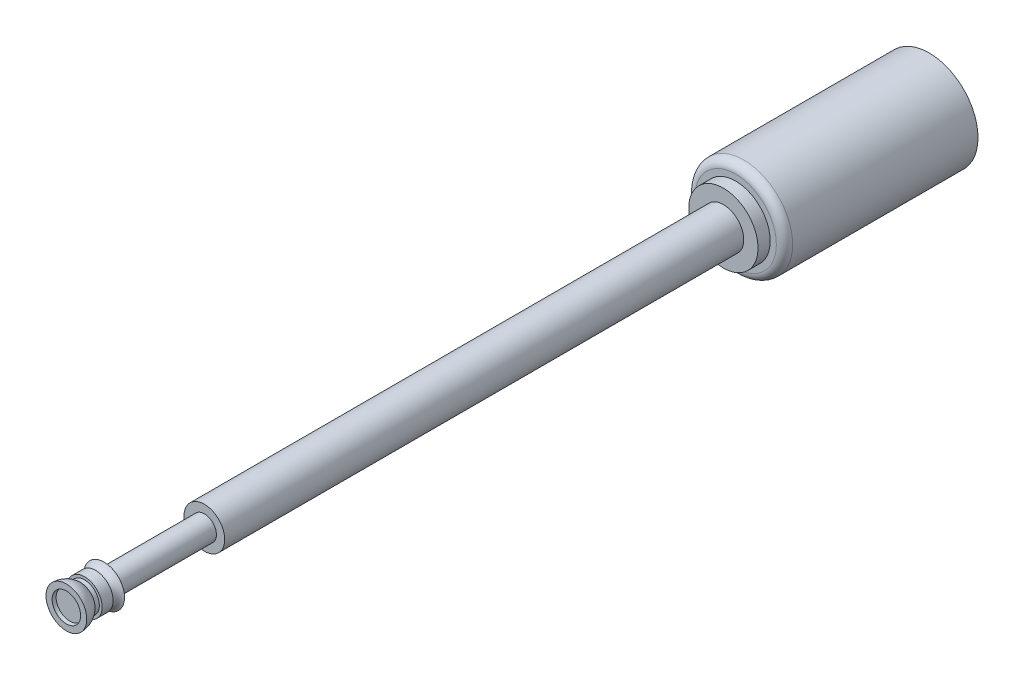
ISO-10303-21;
HEADER;
FILE_DESCRIPTION(('STEP AP214'),'2;1');
FILE_NAME('part.step','',(''),(''),'','','');
FILE_SCHEMA(('AUTOMOTIVE_DESIGN { 1 0 10303 214 1 1 1 1 }'));
ENDSEC;
DATA;
#1=APPLICATION_CONTEXT('core data for automotive mechanical design processes');
#2=APPLICATION_PROTOCOL_DEFINITION('international standard','automotive_design',2000,#1);
#3=PRODUCT_CONTEXT('',#1,'mechanical');
#4=PRODUCT('Part','Part','',(#3));
#5=PRODUCT_RELATED_PRODUCT_CATEGORY('part','',(#4));
#6=PRODUCT_DEFINITION_FORMATION('','',#4);
#7=PRODUCT_DEFINITION_CONTEXT('part definition',#1,'design');
#8=PRODUCT_DEFINITION('design','',#6,#7);
#9=PRODUCT_DEFINITION_SHAPE('','',#8);
#10=(LENGTH_UNIT() NAMED_UNIT(*) SI_UNIT(.MILLI.,.METRE.));
#11=(NAMED_UNIT(*) PLANE_ANGLE_UNIT() SI_UNIT($,.RADIAN.));
#12=(NAMED_UNIT(*) SI_UNIT($,.STERADIAN.) SOLID_ANGLE_UNIT());
#13=UNCERTAINTY_MEASURE_WITH_UNIT(LENGTH_MEASURE(1.E-05),#10,'distance_accuracy_value','');
#14=(GEOMETRIC_REPRESENTATION_CONTEXT(3) GLOBAL_UNCERTAINTY_ASSIGNED_CONTEXT((#13)) GLOBAL_UNIT_ASSIGNED_CONTEXT((#10,
#11,#12)) REPRESENTATION_CONTEXT('',''));
#15=CARTESIAN_POINT('',(0.,0.,0.));
#16=DIRECTION('',(0.,0.,1.));
#17=DIRECTION('',(1.,0.,0.));
#18=AXIS2_PLACEMENT_3D('',#15,#16,#17);
#19=CARTESIAN_POINT('',(0.,0.,393.7));
#20=DIRECTION('',(0.,0.,-1.));
#21=DIRECTION('',(-1.,0.,0.));
#22=AXIS2_PLACEMENT_3D('',#19,#20,#21);
#23=CYLINDRICAL_SURFACE('',#22,12.7);
#24=CARTESIAN_POINT('',(0.,0.,7.62000000000002));
#25=DIRECTION('',(0.,0.,1.));
#26=DIRECTION('',(1.,0.,0.));
#27=AXIS2_PLACEMENT_3D('',#24,#25,#26);
#28=CIRCLE('',#27,12.7);
#29=CARTESIAN_POINT('',(12.7,0.,7.62000000000002));
#30=VERTEX_POINT('',#29);
#31=EDGE_CURVE('E54',#30,#30,#28,.T.);
#32=ORIENTED_EDGE('',*,*,#31,.T.);
#33=EDGE_LOOP('',(#32));
#34=FACE_BOUND('',#33,.T.);
#35=CARTESIAN_POINT('',(0.,0.,331.216));
#36=DIRECTION('',(0.,0.,1.));
#37=DIRECTION('',(1.,0.,0.));
#38=AXIS2_PLACEMENT_3D('',#35,#36,#37);
#39=CIRCLE('',#38,12.7);
#40=CARTESIAN_POINT('',(12.7,0.,331.216));
#41=VERTEX_POINT('',#40);
#42=EDGE_CURVE('E40',#41,#41,#39,.T.);
#43=ORIENTED_EDGE('',*,*,#42,.F.);
#44=EDGE_LOOP('',(#43));
#45=FACE_BOUND('',#44,.T.);
#46=ADVANCED_FACE('F37',(#34,#45),#23,.T.);
#47=CARTESIAN_POINT('',(0.,0.,7.62));
#48=DIRECTION('',(0.,0.,-1.));
#49=DIRECTION('',(-1.,0.,0.));
#50=AXIS2_PLACEMENT_3D('',#47,#48,#49);
#51=CYLINDRICAL_SURFACE('',#50,21.59);
#52=CARTESIAN_POINT('',(0.,0.,7.62));
#53=DIRECTION('',(0.,0.,1.));
#54=DIRECTION('',(1.,0.,0.));
#55=AXIS2_PLACEMENT_3D('',#52,#53,#54);
#56=CIRCLE('',#55,21.59);
#57=CARTESIAN_POINT('',(-21.59,0.,7.62));
#58=VERTEX_POINT('',#57);
#59=EDGE_CURVE('E57',#58,#58,#56,.T.);
#60=CARTESIAN_POINT('',(0.,0.,0.));
#61=DIRECTION('',(0.,0.,1.));
#62=DIRECTION('',(1.,0.,0.));
#63=AXIS2_PLACEMENT_3D('',#60,#61,#62);
#64=CIRCLE('',#63,21.59);
#65=CARTESIAN_POINT('',(-21.59,0.,0.));
#66=VERTEX_POINT('',#65);
#67=EDGE_CURVE('E60',#66,#66,#64,.T.);
#68=CARTESIAN_POINT('',(-21.59,0.,7.62));
#69=CARTESIAN_POINT('',(-21.59,0.,7.540625));
#70=CARTESIAN_POINT('',(-21.59,0.,7.46125));
#71=CARTESIAN_POINT('',(-21.59,0.,7.3025));
#72=CARTESIAN_POINT('',(-21.59,0.,7.223125));
#73=CARTESIAN_POINT('',(-21.59,0.,7.064375));
#74=CARTESIAN_POINT('',(-21.59,0.,6.985));
#75=CARTESIAN_POINT('',(-21.59,0.,6.82625));
#76=CARTESIAN_POINT('',(-21.59,0.,6.746875));
#77=CARTESIAN_POINT('',(-21.59,0.,6.588125));
#78=CARTESIAN_POINT('',(-21.59,0.,6.50875));
#79=CARTESIAN_POINT('',(-21.59,0.,6.35));
#80=CARTESIAN_POINT('',(-21.59,0.,6.270625));
#81=CARTESIAN_POINT('',(-21.59,0.,6.111875));
#82=CARTESIAN_POINT('',(-21.59,0.,6.0325));
#83=CARTESIAN_POINT('',(-21.59,0.,5.87375));
#84=CARTESIAN_POINT('',(-21.59,0.,5.794375));
#85=CARTESIAN_POINT('',(-21.59,0.,5.635625));
#86=CARTESIAN_POINT('',(-21.59,0.,5.55625));
#87=CARTESIAN_POINT('',(-21.59,0.,5.3975));
#88=CARTESIAN_POINT('',(-21.59,0.,5.318125));
#89=CARTESIAN_POINT('',(-21.59,0.,5.159375));
#90=CARTESIAN_POINT('',(-21.59,0.,5.08));
#91=CARTESIAN_POINT('',(-21.59,0.,4.92125));
#92=CARTESIAN_POINT('',(-21.59,0.,4.841875));
#93=CARTESIAN_POINT('',(-21.59,0.,4.683125));
#94=CARTESIAN_POINT('',(-21.59,0.,4.60375));
#95=CARTESIAN_POINT('',(-21.59,0.,4.445));
#96=CARTESIAN_POINT('',(-21.59,0.,4.365625));
#97=CARTESIAN_POINT('',(-21.59,0.,4.206875));
#98=CARTESIAN_POINT('',(-21.59,0.,4.1275));
#99=CARTESIAN_POINT('',(-21.59,0.,3.96875));
#100=CARTESIAN_POINT('',(-21.59,0.,3.889375));
#101=CARTESIAN_POINT('',(-21.59,0.,3.730625));
#102=CARTESIAN_POINT('',(-21.59,0.,3.65125));
#103=CARTESIAN_POINT('',(-21.59,0.,3.4925));
#104=CARTESIAN_POINT('',(-21.59,0.,3.413125));
#105=CARTESIAN_POINT('',(-21.59,0.,3.254375));
#106=CARTESIAN_POINT('',(-21.59,0.,3.175));
#107=CARTESIAN_POINT('',(-21.59,0.,3.01625));
#108=CARTESIAN_POINT('',(-21.59,0.,2.936875));
#109=CARTESIAN_POINT('',(-21.59,0.,2.778125));
#110=CARTESIAN_POINT('',(-21.59,0.,2.69875));
#111=CARTESIAN_POINT('',(-21.59,0.,2.54));
#112=CARTESIAN_POINT('',(-21.59,0.,2.460625));
#113=CARTESIAN_POINT('',(-21.59,0.,2.301875));
#114=CARTESIAN_POINT('',(-21.59,0.,2.2225));
#115=CARTESIAN_POINT('',(-21.59,0.,2.06375));
#116=CARTESIAN_POINT('',(-21.59,0.,1.984375));
#117=CARTESIAN_POINT('',(-21.59,0.,1.825625));
#118=CARTESIAN_POINT('',(-21.59,0.,1.74625));
#119=CARTESIAN_POINT('',(-21.59,0.,1.5875));
#120=CARTESIAN_POINT('',(-21.59,0.,1.508125));
#121=CARTESIAN_POINT('',(-21.59,0.,1.349375));
#122=CARTESIAN_POINT('',(-21.59,0.,1.27));
#123=CARTESIAN_POINT('',(-21.59,0.,1.11125));
#124=CARTESIAN_POINT('',(-21.59,0.,1.031875));
#125=CARTESIAN_POINT('',(-21.59,0.,0.873125));
#126=CARTESIAN_POINT('',(-21.59,0.,0.79375));
#127=CARTESIAN_POINT('',(-21.59,0.,0.635));
#128=CARTESIAN_POINT('',(-21.59,0.,0.555625));
#129=CARTESIAN_POINT('',(-21.59,0.,0.396875));
#130=CARTESIAN_POINT('',(-21.59,0.,0.3175));
#131=CARTESIAN_POINT('',(-21.59,0.,0.15875));
#132=CARTESIAN_POINT('',(-21.59,0.,0.0793749999999999));
#133=CARTESIAN_POINT('',(-21.59,0.,0.));
#134=B_SPLINE_CURVE_WITH_KNOTS('',3,(#68,#69,#70,#71,#72,#73,#74,#75,#76,#77,#78,#79,#80,#81,
#82,#83,#84,#85,#86,#87,#88,#89,#90,#91,#92,#93,#94,#95,#96,#97,#98,#99,#100,#101,#102,#103,
#104,#105,#106,#107,#108,#109,#110,#111,#112,#113,#114,#115,#116,#117,#118,#119,#120,#121,#122,
#123,#124,#125,#126,#127,#128,#129,#130,#131,#132,#133),.UNSPECIFIED.,.F.,.F.,(4,2,2,2,2,2,2,2,
2,2,2,2,2,2,2,2,2,2,2,2,2,2,2,2,2,2,2,2,2,2,2,2,4),(0.,0.238125,0.476249999999999,0.714375,
0.952499999999999,1.190625,1.42875,1.666875,1.905,2.143125,2.38125,2.619375,2.8575,3.095625,
3.33375,3.571875,3.81,4.048125,4.28625,4.524375,4.7625,5.000625,5.23875,5.476875,5.715,5.953125,
6.19125,6.429375,6.6675,6.905625,7.14375,7.381875,7.62),.UNSPECIFIED.);
#135=EDGE_CURVE('BSEAM125',#58,#66,#134,.T.);
#136=ORIENTED_EDGE('',*,*,#59,.F.);
#137=ORIENTED_EDGE('',*,*,#67,.T.);
#138=ORIENTED_EDGE('',*,*,#135,.T.);
#139=ORIENTED_EDGE('',*,*,#135,.F.);
#140=EDGE_LOOP('',(#136,#138,#137,#139));
#141=FACE_BOUND('',#140,.T.);
#142=ADVANCED_FACE('F125',(#141),#51,.T.);
#143=CARTESIAN_POINT('',(0.,0.,7.62));
#144=DIRECTION('',(0.,0.,1.));
#145=DIRECTION('',(1.,0.,0.));
#146=AXIS2_PLACEMENT_3D('',#143,#144,#145);
#147=PLANE('',#146);
#148=ORIENTED_EDGE('',*,*,#31,.F.);
#149=EDGE_LOOP('',(#148));
#150=FACE_BOUND('',#149,.T.);
#151=ORIENTED_EDGE('',*,*,#59,.T.);
#152=EDGE_LOOP('',(#151));
#153=FACE_BOUND('',#152,.T.);
#154=ADVANCED_FACE('F130',(#150,#153),#147,.T.);
#155=CARTESIAN_POINT('',(0.,0.,-120.65));
#156=DIRECTION('',(0.,0.,1.));
#157=DIRECTION('',(1.,0.,0.));
#158=AXIS2_PLACEMENT_3D('',#155,#156,#157);
#159=CYLINDRICAL_SURFACE('',#158,12.7);
#160=CARTESIAN_POINT('',(0.,0.,-120.65));
#161=DIRECTION('',(0.,0.,1.));
#162=DIRECTION('',(1.,0.,0.));
#163=AXIS2_PLACEMENT_3D('',#160,#161,#162);
#164=CIRCLE('',#163,12.7);
#165=CARTESIAN_POINT('',(12.7,0.,-120.65));
#166=VERTEX_POINT('',#165);
#167=EDGE_CURVE('E72',#166,#166,#164,.T.);
#168=CARTESIAN_POINT('',(0.,0.,0.));
#169=DIRECTION('',(0.,0.,1.));
#170=DIRECTION('',(1.,0.,0.));
#171=AXIS2_PLACEMENT_3D('',#168,#169,#170);
#172=CIRCLE('',#171,12.7);
#173=CARTESIAN_POINT('',(12.7,0.,0.));
#174=VERTEX_POINT('',#173);
#175=EDGE_CURVE('E49',#174,#174,#172,.T.);
#176=CARTESIAN_POINT('',(12.7,0.,-120.65));
#177=CARTESIAN_POINT('',(12.7,0.,-119.393229166667));
#178=CARTESIAN_POINT('',(12.7,0.,-118.136458333333));
#179=CARTESIAN_POINT('',(12.7,0.,-115.622916666667));
#180=CARTESIAN_POINT('',(12.7,0.,-114.366145833333));
#181=CARTESIAN_POINT('',(12.7,0.,-111.852604166667));
#182=CARTESIAN_POINT('',(12.7,0.,-110.595833333333));
#183=CARTESIAN_POINT('',(12.7,0.,-108.082291666667));
#184=CARTESIAN_POINT('',(12.7,0.,-106.825520833333));
#185=CARTESIAN_POINT('',(12.7,0.,-104.311979166667));
#186=CARTESIAN_POINT('',(12.7,0.,-103.055208333333));
#187=CARTESIAN_POINT('',(12.7,0.,-100.541666666667));
#188=CARTESIAN_POINT('',(12.7,0.,-99.2848958333334));
#189=CARTESIAN_POINT('',(12.7,0.,-96.7713541666667));
#190=CARTESIAN_POINT('',(12.7,0.,-95.5145833333333));
#191=CARTESIAN_POINT('',(12.7,0.,-93.0010416666667));
#192=CARTESIAN_POINT('',(12.7,0.,-91.7442708333333));
#193=CARTESIAN_POINT('',(12.7,0.,-89.2307291666667));
#194=CARTESIAN_POINT('',(12.7,0.,-87.9739583333333));
#195=CARTESIAN_POINT('',(12.7,0.,-85.4604166666667));
#196=CARTESIAN_POINT('',(12.7,0.,-84.2036458333333));
#197=CARTESIAN_POINT('',(12.7,0.,-81.6901041666667));
#198=CARTESIAN_POINT('',(12.7,0.,-80.4333333333333));
#199=CARTESIAN_POINT('',(12.7,0.,-77.9197916666667));
#200=CARTESIAN_POINT('',(12.7,0.,-76.6630208333333));
#201=CARTESIAN_POINT('',(12.7,0.,-74.1494791666667));
#202=CARTESIAN_POINT('',(12.7,0.,-72.8927083333333));
#203=CARTESIAN_POINT('',(12.7,0.,-70.3791666666667));
#204=CARTESIAN_POINT('',(12.7,0.,-69.1223958333333));
#205=CARTESIAN_POINT('',(12.7,0.,-66.6088541666667));
#206=CARTESIAN_POINT('',(12.7,0.,-65.3520833333333));
#207=CARTESIAN_POINT('',(12.7,0.,-62.8385416666667));
#208=CARTESIAN_POINT('',(12.7,0.,-61.5817708333333));
#209=CARTESIAN_POINT('',(12.7,0.,-59.0682291666667));
#210=CARTESIAN_POINT('',(12.7,0.,-57.8114583333333));
#211=CARTESIAN_POINT('',(12.7,0.,-55.2979166666667));
#212=CARTESIAN_POINT('',(12.7,0.,-54.0411458333333));
#213=CARTESIAN_POINT('',(12.7,0.,-51.5276041666667));
#214=CARTESIAN_POINT('',(12.7,0.,-50.2708333333333));
#215=CARTESIAN_POINT('',(12.7,0.,-47.7572916666667));
#216=CARTESIAN_POINT('',(12.7,0.,-46.5005208333333));
#217=CARTESIAN_POINT('',(12.7,0.,-43.9869791666667));
#218=CARTESIAN_POINT('',(12.7,0.,-42.7302083333333));
#219=CARTESIAN_POINT('',(12.7,0.,-40.2166666666667));
#220=CARTESIAN_POINT('',(12.7,0.,-38.9598958333333));
#221=CARTESIAN_POINT('',(12.7,0.,-36.4463541666667));
#222=CARTESIAN_POINT('',(12.7,0.,-35.1895833333333));
#223=CARTESIAN_POINT('',(12.7,0.,-32.6760416666667));
#224=CARTESIAN_POINT('',(12.7,0.,-31.4192708333333));
#225=CARTESIAN_POINT('',(12.7,0.,-28.9057291666667));
#226=CARTESIAN_POINT('',(12.7,0.,-27.6489583333333));
#227=CARTESIAN_POINT('',(12.7,0.,-25.1354166666667));
#228=CARTESIAN_POINT('',(12.7,0.,-23.8786458333333));
#229=CARTESIAN_POINT('',(12.7,0.,-21.3651041666667));
#230=CARTESIAN_POINT('',(12.7,0.,-20.1083333333333));
#231=CARTESIAN_POINT('',(12.7,0.,-17.5947916666667));
#232=CARTESIAN_POINT('',(12.7,0.,-16.3380208333333));
#233=CARTESIAN_POINT('',(12.7,0.,-13.8244791666667));
#234=CARTESIAN_POINT('',(12.7,0.,-12.5677083333333));
#235=CARTESIAN_POINT('',(12.7,0.,-10.0541666666667));
#236=CARTESIAN_POINT('',(12.7,0.,-8.79739583333333));
#237=CARTESIAN_POINT('',(12.7,0.,-6.28385416666666));
#238=CARTESIAN_POINT('',(12.7,0.,-5.02708333333333));
#239=CARTESIAN_POINT('',(12.7,0.,-2.51354166666666));
#240=CARTESIAN_POINT('',(12.7,0.,-1.25677083333333));
#241=CARTESIAN_POINT('',(12.7,0.,0.));
#242=B_SPLINE_CURVE_WITH_KNOTS('',3,(#176,#177,#178,#179,#180,#181,#182,#183,#184,#185,#186,
#187,#188,#189,#190,#191,#192,#193,#194,#195,#196,#197,#198,#199,#200,#201,#202,#203,#204,#205,
#206,#207,#208,#209,#210,#211,#212,#213,#214,#215,#216,#217,#218,#219,#220,#221,#222,#223,#224,
#225,#226,#227,#228,#229,#230,#231,#232,#233,#234,#235,#236,#237,#238,#239,#240,#241),
.UNSPECIFIED.,.F.,.F.,(4,2,2,2,2,2,2,2,2,2,2,2,2,2,2,2,2,2,2,2,2,2,2,2,2,2,2,2,2,2,2,2,4),(0.,
3.7703125,7.540625,11.3109375,15.08125,18.8515625,22.621875,26.3921875,30.1625,33.9328125,
37.703125,41.4734375,45.24375,49.0140625,52.784375,56.5546875,60.325,64.0953125,67.865625,
71.6359375,75.40625,79.1765625,82.946875,86.7171875,90.4875,94.2578125,98.028125,101.7984375,
105.56875,109.3390625,113.109375,116.8796875,120.65),.UNSPECIFIED.);
#243=EDGE_CURVE('BSEAM156',#166,#174,#242,.T.);
#244=ORIENTED_EDGE('',*,*,#167,.F.);
#245=ORIENTED_EDGE('',*,*,#175,.T.);
#246=ORIENTED_EDGE('',*,*,#243,.T.);
#247=ORIENTED_EDGE('',*,*,#243,.F.);
#248=EDGE_LOOP('',(#244,#246,#245,#247));
#249=FACE_BOUND('',#248,.T.);
#250=ADVANCED_FACE('F156',(#249),#159,.F.);
#251=CARTESIAN_POINT('',(0.,0.,-120.65));
#252=DIRECTION('',(0.,0.,1.));
#253=DIRECTION('',(1.,0.,0.));
#254=AXIS2_PLACEMENT_3D('',#251,#252,#253);
#255=CYLINDRICAL_SURFACE('',#254,30.48);
#256=CARTESIAN_POINT('',(0.,0.,-5.08));
#257=DIRECTION('',(0.,0.,1.));
#258=DIRECTION('',(1.,0.,0.));
#259=AXIS2_PLACEMENT_3D('',#256,#257,#258);
#260=CIRCLE('',#259,30.48);
#261=CARTESIAN_POINT('',(30.48,0.,-5.08));
#262=VERTEX_POINT('',#261);
#263=EDGE_CURVE('E63',#262,#262,#260,.F.);
#264=CARTESIAN_POINT('',(0.,0.,-120.65));
#265=DIRECTION('',(0.,0.,1.));
#266=DIRECTION('',(1.,0.,0.));
#267=AXIS2_PLACEMENT_3D('',#264,#265,#266);
#268=CIRCLE('',#267,30.48);
#269=CARTESIAN_POINT('',(30.48,0.,-120.65));
#270=VERTEX_POINT('',#269);
#271=EDGE_CURVE('E69',#270,#270,#268,.T.);
#272=CARTESIAN_POINT('',(30.48,0.,-5.08));
#273=CARTESIAN_POINT('',(30.48,0.,-6.28385416666667));
#274=CARTESIAN_POINT('',(30.48,0.,-7.48770833333333));
#275=CARTESIAN_POINT('',(30.48,0.,-9.89541666666667));
#276=CARTESIAN_POINT('',(30.48,0.,-11.0992708333333));
#277=CARTESIAN_POINT('',(30.48,0.,-13.5069791666667));
#278=CARTESIAN_POINT('',(30.48,0.,-14.7108333333333));
#279=CARTESIAN_POINT('',(30.48,0.,-17.1185416666667));
#280=CARTESIAN_POINT('',(30.48,0.,-18.3223958333333));
#281=CARTESIAN_POINT('',(30.48,0.,-20.7301041666667));
#282=CARTESIAN_POINT('',(30.48,0.,-21.9339583333333));
#283=CARTESIAN_POINT('',(30.48,0.,-24.3416666666667));
#284=CARTESIAN_POINT('',(30.48,0.,-25.5455208333333));
#285=CARTESIAN_POINT('',(30.48,0.,-27.9532291666667));
#286=CARTESIAN_POINT('',(30.48,0.,-29.1570833333333));
#287=CARTESIAN_POINT('',(30.48,0.,-31.5647916666667));
#288=CARTESIAN_POINT('',(30.48,0.,-32.7686458333333));
#289=CARTESIAN_POINT('',(30.48,0.,-35.1763541666667));
#290=CARTESIAN_POINT('',(30.48,0.,-36.3802083333333));
#291=CARTESIAN_POINT('',(30.48,0.,-38.7879166666667));
#292=CARTESIAN_POINT('',(30.48,0.,-39.9917708333333));
#293=CARTESIAN_POINT('',(30.48,0.,-42.3994791666667));
#294=CARTESIAN_POINT('',(30.48,0.,-43.6033333333333));
#295=CARTESIAN_POINT('',(30.48,0.,-46.0110416666667));
#296=CARTESIAN_POINT('',(30.48,0.,-47.2148958333333));
#297=CARTESIAN_POINT('',(30.48,0.,-49.6226041666667));
#298=CARTESIAN_POINT('',(30.48,0.,-50.8264583333333));
#299=CARTESIAN_POINT('',(30.48,0.,-53.2341666666667));
#300=CARTESIAN_POINT('',(30.48,0.,-54.4380208333333));
#301=CARTESIAN_POINT('',(30.48,0.,-56.8457291666667));
#302=CARTESIAN_POINT('',(30.48,0.,-58.0495833333333));
#303=CARTESIAN_POINT('',(30.48,0.,-60.4572916666667));
#304=CARTESIAN_POINT('',(30.48,0.,-61.6611458333333));
#305=CARTESIAN_POINT('',(30.48,0.,-64.0688541666667));
#306=CARTESIAN_POINT('',(30.48,0.,-65.2727083333333));
#307=CARTESIAN_POINT('',(30.48,0.,-67.6804166666667));
#308=CARTESIAN_POINT('',(30.48,0.,-68.8842708333333));
#309=CARTESIAN_POINT('',(30.48,0.,-71.2919791666667));
#310=CARTESIAN_POINT('',(30.48,0.,-72.4958333333333));
#311=CARTESIAN_POINT('',(30.48,0.,-74.9035416666667));
#312=CARTESIAN_POINT('',(30.48,0.,-76.1073958333333));
#313=CARTESIAN_POINT('',(30.48,0.,-78.5151041666667));
#314=CARTESIAN_POINT('',(30.48,0.,-79.7189583333333));
#315=CARTESIAN_POINT('',(30.48,0.,-82.1266666666667));
#316=CARTESIAN_POINT('',(30.48,0.,-83.3305208333333));
#317=CARTESIAN_POINT('',(30.48,0.,-85.7382291666667));
#318=CARTESIAN_POINT('',(30.48,0.,-86.9420833333333));
#319=CARTESIAN_POINT('',(30.48,0.,-89.3497916666667));
#320=CARTESIAN_POINT('',(30.48,0.,-90.5536458333333));
#321=CARTESIAN_POINT('',(30.48,0.,-92.9613541666667));
#322=CARTESIAN_POINT('',(30.48,0.,-94.1652083333333));
#323=CARTESIAN_POINT('',(30.48,0.,-96.5729166666667));
#324=CARTESIAN_POINT('',(30.48,0.,-97.7767708333333));
#325=CARTESIAN_POINT('',(30.48,0.,-100.184479166667));
#326=CARTESIAN_POINT('',(30.48,0.,-101.388333333333));
#327=CARTESIAN_POINT('',(30.48,0.,-103.796041666667));
#328=CARTESIAN_POINT('',(30.48,0.,-104.999895833333));
#329=CARTESIAN_POINT('',(30.48,0.,-107.407604166667));
#330=CARTESIAN_POINT('',(30.48,0.,-108.611458333333));
#331=CARTESIAN_POINT('',(30.48,0.,-111.019166666667));
#332=CARTESIAN_POINT('',(30.48,0.,-112.223020833333));
#333=CARTESIAN_POINT('',(30.48,0.,-114.630729166667));
#334=CARTESIAN_POINT('',(30.48,0.,-115.834583333333));
#335=CARTESIAN_POINT('',(30.48,0.,-118.242291666667));
#336=CARTESIAN_POINT('',(30.48,0.,-119.446145833333));
#337=CARTESIAN_POINT('',(30.48,0.,-120.65));
#338=B_SPLINE_CURVE_WITH_KNOTS('',3,(#272,#273,#274,#275,#276,#277,#278,#279,#280,#281,#282,
#283,#284,#285,#286,#287,#288,#289,#290,#291,#292,#293,#294,#295,#296,#297,#298,#299,#300,#301,
#302,#303,#304,#305,#306,#307,#308,#309,#310,#311,#312,#313,#314,#315,#316,#317,#318,#319,#320,
#321,#322,#323,#324,#325,#326,#327,#328,#329,#330,#331,#332,#333,#334,#335,#336,#337),
.UNSPECIFIED.,.F.,.F.,(4,2,2,2,2,2,2,2,2,2,2,2,2,2,2,2,2,2,2,2,2,2,2,2,2,2,2,2,2,2,2,2,4),(0.,
3.6115625,7.223125,10.8346875,14.44625,18.0578125,21.669375,25.2809375,28.8925,32.5040625,
36.115625,39.7271875,43.33875,46.9503125,50.561875,54.1734375,57.785,61.3965625,65.008125,
68.6196875,72.23125,75.8428125,79.454375,83.0659375,86.6775,90.2890625,93.900625,97.5121875,
101.12375,104.7353125,108.346875,111.9584375,115.57),.UNSPECIFIED.);
#339=EDGE_CURVE('BSEAM161',#262,#270,#338,.T.);
#340=ORIENTED_EDGE('',*,*,#263,.T.);
#341=ORIENTED_EDGE('',*,*,#271,.T.);
#342=ORIENTED_EDGE('',*,*,#339,.T.);
#343=ORIENTED_EDGE('',*,*,#339,.F.);
#344=EDGE_LOOP('',(#340,#342,#341,#343));
#345=FACE_BOUND('',#344,.T.);
#346=ADVANCED_FACE('F161',(#345),#255,.T.);
#347=CARTESIAN_POINT('',(0.,0.,-120.65));
#348=DIRECTION('',(0.,0.,1.));
#349=DIRECTION('',(1.,0.,0.));
#350=AXIS2_PLACEMENT_3D('',#347,#348,#349);
#351=PLANE('',#350);
#352=ORIENTED_EDGE('',*,*,#167,.T.);
#353=EDGE_LOOP('',(#352));
#354=FACE_BOUND('',#353,.T.);
#355=ORIENTED_EDGE('',*,*,#271,.F.);
#356=EDGE_LOOP('',(#355));
#357=FACE_BOUND('',#356,.T.);
#358=ADVANCED_FACE('F165',(#354,#357),#351,.F.);
#359=CARTESIAN_POINT('',(0.,0.,0.));
#360=DIRECTION('',(0.,0.,1.));
#361=DIRECTION('',(1.,0.,0.));
#362=AXIS2_PLACEMENT_3D('',#359,#360,#361);
#363=PLANE('',#362);
#364=ORIENTED_EDGE('',*,*,#67,.F.);
#365=EDGE_LOOP('',(#364));
#366=FACE_BOUND('',#365,.T.);
#367=CARTESIAN_POINT('',(0.,0.,0.));
#368=DIRECTION('',(0.,0.,1.));
#369=DIRECTION('',(1.,0.,0.));
#370=AXIS2_PLACEMENT_3D('',#367,#368,#369);
#371=CIRCLE('',#370,25.4);
#372=CARTESIAN_POINT('',(25.4,0.,0.));
#373=VERTEX_POINT('',#372);
#374=EDGE_CURVE('E66',#373,#373,#371,.T.);
#375=ORIENTED_EDGE('',*,*,#374,.T.);
#376=EDGE_LOOP('',(#375));
#377=FACE_BOUND('',#376,.T.);
#378=ADVANCED_FACE('F150',(#366,#377),#363,.T.);
#379=CARTESIAN_POINT('',(0.,0.,-5.08));
#380=DIRECTION('',(0.,0.,1.));
#381=DIRECTION('',(1.,0.,0.));
#382=AXIS2_PLACEMENT_3D('',#379,#380,#381);
#383=TOROIDAL_SURFACE('',#382,25.4,5.08);
#384=ORIENTED_EDGE('',*,*,#263,.F.);
#385=EDGE_LOOP('',(#384));
#386=FACE_BOUND('',#385,.T.);
#387=ORIENTED_EDGE('',*,*,#374,.F.);
#388=EDGE_LOOP('',(#387));
#389=FACE_BOUND('',#388,.T.);
#390=ADVANCED_FACE('F144',(#386,#389),#383,.T.);
#391=CARTESIAN_POINT('',(0.,0.,0.));
#392=DIRECTION('',(0.,0.,1.));
#393=DIRECTION('',(1.,0.,0.));
#394=AXIS2_PLACEMENT_3D('',#391,#392,#393);
#395=PLANE('',#394);
#396=ORIENTED_EDGE('',*,*,#175,.F.);
#397=EDGE_LOOP('',(#396));
#398=FACE_BOUND('',#397,.T.);
#399=ADVANCED_FACE('F139',(#398),#395,.F.);
#400=CARTESIAN_POINT('',(-26.9315656539725,0.,331.216));
#401=DIRECTION('',(0.,0.,1.));
#402=DIRECTION('',(1.,0.,0.));
#403=AXIS2_PLACEMENT_3D('',#400,#401,#402);
#404=PLANE('',#403);
#405=CARTESIAN_POINT('',(0.,0.,331.216));
#406=DIRECTION('',(0.,0.,1.));
#407=DIRECTION('',(1.,0.,0.));
#408=AXIS2_PLACEMENT_3D('',#405,#406,#407);
#409=CIRCLE('',#408,7.52347999999999);
#410=CARTESIAN_POINT('',(7.52347999999998,0.,331.216));
#411=VERTEX_POINT('',#410);
#412=EDGE_CURVE('E99',#411,#411,#409,.T.);
#413=ORIENTED_EDGE('',*,*,#412,.F.);
#414=EDGE_LOOP('',(#413));
#415=FACE_BOUND('',#414,.T.);
#416=ORIENTED_EDGE('',*,*,#42,.T.);
#417=EDGE_LOOP('',(#416));
#418=FACE_BOUND('',#417,.T.);
#419=ADVANCED_FACE('F121',(#415,#418),#404,.T.);
#420=CARTESIAN_POINT('',(-26.9315656539724,0.,393.7));
#421=DIRECTION('',(0.,0.,-1.));
#422=DIRECTION('',(-1.,0.,0.));
#423=AXIS2_PLACEMENT_3D('',#420,#421,#422);
#424=PLANE('',#423);
#425=CARTESIAN_POINT('',(0.,0.,393.7));
#426=DIRECTION('',(0.,0.,1.));
#427=DIRECTION('',(1.,0.,0.));
#428=AXIS2_PLACEMENT_3D('',#425,#426,#427);
#429=CIRCLE('',#428,7.52347999999999);
#430=CARTESIAN_POINT('',(7.52347999999999,0.,393.7));
#431=VERTEX_POINT('',#430);
#432=EDGE_CURVE('E102',#431,#431,#429,.T.);
#433=ORIENTED_EDGE('',*,*,#432,.T.);
#434=EDGE_LOOP('',(#433));
#435=FACE_BOUND('',#434,.T.);
#436=CARTESIAN_POINT('',(0.,0.,393.7));
#437=DIRECTION('',(0.,0.,1.));
#438=DIRECTION('',(1.,0.,0.));
#439=AXIS2_PLACEMENT_3D('',#436,#437,#438);
#440=CIRCLE('',#439,12.7);
#441=CARTESIAN_POINT('',(12.7,0.,393.7));
#442=VERTEX_POINT('',#441);
#443=EDGE_CURVE('E96',#442,#442,#440,.F.);
#444=ORIENTED_EDGE('',*,*,#443,.T.);
#445=EDGE_LOOP('',(#444));
#446=FACE_BOUND('',#445,.T.);
#447=ADVANCED_FACE('F106',(#435,#446),#424,.T.);
#448=CARTESIAN_POINT('',(0.,0.,417.2585));
#449=DIRECTION('',(0.,0.,1.));
#450=DIRECTION('',(1.,0.,0.));
#451=AXIS2_PLACEMENT_3D('',#448,#449,#450);
#452=CYLINDRICAL_SURFACE('',#451,7.52347999999999);
#453=ORIENTED_EDGE('',*,*,#412,.T.);
#454=EDGE_LOOP('',(#453));
#455=FACE_BOUND('',#454,.T.);
#456=ORIENTED_EDGE('',*,*,#432,.F.);
#457=EDGE_LOOP('',(#456));
#458=FACE_BOUND('',#457,.T.);
#459=ADVANCED_FACE('F109',(#455,#458),#452,.T.);
#460=CARTESIAN_POINT('',(-11.4554493475856,0.,415.036));
#461=DIRECTION('',(0.,0.,-1.));
#462=DIRECTION('',(-1.,0.,0.));
#463=AXIS2_PLACEMENT_3D('',#460,#461,#462);
#464=PLANE('',#463);
#465=CARTESIAN_POINT('',(0.,0.,415.036));
#466=DIRECTION('',(0.,0.,-1.));
#467=DIRECTION('',(-1.,0.,0.));
#468=AXIS2_PLACEMENT_3D('',#465,#466,#467);
#469=CIRCLE('',#468,8.607705486946);
#470=CARTESIAN_POINT('',(-8.607705486946,0.,415.036));
#471=VERTEX_POINT('',#470);
#472=EDGE_CURVE('E45',#471,#471,#469,.F.);
#473=ORIENTED_EDGE('',*,*,#472,.T.);
#474=EDGE_LOOP('',(#473));
#475=FACE_BOUND('',#474,.T.);
#476=ADVANCED_FACE('F111',(#475),#464,.F.);
#477=CARTESIAN_POINT('',(0.,0.,417.2585));
#478=DIRECTION('',(0.,0.,-1.));
#479=DIRECTION('',(1.,0.,0.));
#480=AXIS2_PLACEMENT_3D('',#477,#478,#479);
#481=SPHERICAL_SURFACE('',#480,8.89);
#482=CARTESIAN_POINT('',(0.,0.,417.2585));
#483=DIRECTION('',(0.,0.,-1.));
#484=DIRECTION('',(-1.,0.,0.));
#485=AXIS2_PLACEMENT_3D('',#482,#483,#484);
#486=CIRCLE('',#485,8.89);
#487=CARTESIAN_POINT('',(-8.89,0.,417.2585));
#488=VERTEX_POINT('',#487);
#489=EDGE_CURVE('E93',#488,#488,#486,.T.);
#490=ORIENTED_EDGE('',*,*,#489,.F.);
#491=EDGE_LOOP('',(#490));
#492=FACE_BOUND('',#491,.T.);
#493=ORIENTED_EDGE('',*,*,#472,.F.);
#494=EDGE_LOOP('',(#493));
#495=FACE_BOUND('',#494,.T.);
#496=ADVANCED_FACE('F118',(#492,#495),#481,.F.);
#497=CARTESIAN_POINT('',(8.89,0.,417.2585));
#498=DIRECTION('',(0.,0.,-1.));
#499=DIRECTION('',(-1.,0.,0.));
#500=AXIS2_PLACEMENT_3D('',#497,#498,#499);
#501=PLANE('',#500);
#502=CARTESIAN_POINT('',(0.,0.,417.2585));
#503=DIRECTION('',(0.,0.,-1.));
#504=DIRECTION('',(-1.,0.,0.));
#505=AXIS2_PLACEMENT_3D('',#502,#503,#504);
#506=CIRCLE('',#505,12.7);
#507=CARTESIAN_POINT('',(-12.7,0.,417.2585));
#508=VERTEX_POINT('',#507);
#509=EDGE_CURVE('E90',#508,#508,#506,.T.);
#510=ORIENTED_EDGE('',*,*,#509,.F.);
#511=EDGE_LOOP('',(#510));
#512=FACE_BOUND('',#511,.T.);
#513=ORIENTED_EDGE('',*,*,#489,.T.);
#514=EDGE_LOOP('',(#513));
#515=FACE_BOUND('',#514,.T.);
#516=ADVANCED_FACE('F196',(#512,#515),#501,.F.);
#517=CARTESIAN_POINT('',(0.,0.,417.2585));
#518=DIRECTION('',(0.,0.,-1.));
#519=DIRECTION('',(1.,0.,0.));
#520=AXIS2_PLACEMENT_3D('',#517,#518,#519);
#521=SPHERICAL_SURFACE('',#520,12.7);
#522=CARTESIAN_POINT('',(0.,0.,408.553989399969));
#523=DIRECTION('',(0.,0.,-1.));
#524=DIRECTION('',(-1.,0.,0.));
#525=AXIS2_PLACEMENT_3D('',#522,#523,#524);
#526=CIRCLE('',#525,9.2477832594597);
#527=CARTESIAN_POINT('',(-9.2477832594597,0.,408.553989399969));
#528=VERTEX_POINT('',#527);
#529=EDGE_CURVE('E87',#528,#528,#526,.T.);
#530=ORIENTED_EDGE('',*,*,#529,.F.);
#531=EDGE_LOOP('',(#530));
#532=FACE_BOUND('',#531,.T.);
#533=ORIENTED_EDGE('',*,*,#509,.T.);
#534=EDGE_LOOP('',(#533));
#535=FACE_BOUND('',#534,.T.);
#536=ADVANCED_FACE('F192',(#532,#535),#521,.T.);
#537=CARTESIAN_POINT('',(0.,0.,393.7));
#538=DIRECTION('',(0.,0.,-1.));
#539=DIRECTION('',(-1.,0.,0.));
#540=AXIS2_PLACEMENT_3D('',#537,#538,#539);
#541=CYLINDRICAL_SURFACE('',#540,9.2477832594597);
#542=CARTESIAN_POINT('',(0.,0.,405.935541367785));
#543=DIRECTION('',(0.,0.,-1.));
#544=DIRECTION('',(-1.,0.,0.));
#545=AXIS2_PLACEMENT_3D('',#542,#543,#544);
#546=CIRCLE('',#545,9.24778325945971);
#547=CARTESIAN_POINT('',(-9.24778325945971,0.,405.935541367785));
#548=VERTEX_POINT('',#547);
#549=EDGE_CURVE('E84',#548,#548,#546,.T.);
#550=ORIENTED_EDGE('',*,*,#549,.F.);
#551=EDGE_LOOP('',(#550));
#552=FACE_BOUND('',#551,.T.);
#553=ORIENTED_EDGE('',*,*,#529,.T.);
#554=EDGE_LOOP('',(#553));
#555=FACE_BOUND('',#554,.T.);
#556=ADVANCED_FACE('F188',(#552,#555),#541,.T.);
#557=CARTESIAN_POINT('',(9.24778325945971,0.,405.935541367785));
#558=DIRECTION('',(0.,0.,-1.));
#559=DIRECTION('',(-1.,0.,0.));
#560=AXIS2_PLACEMENT_3D('',#557,#558,#559);
#561=PLANE('',#560);
#562=CARTESIAN_POINT('',(0.,0.,405.935541367785));
#563=DIRECTION('',(0.,0.,-1.));
#564=DIRECTION('',(-1.,0.,0.));
#565=AXIS2_PLACEMENT_3D('',#562,#563,#564);
#566=CIRCLE('',#565,10.9475511393123);
#567=CARTESIAN_POINT('',(-10.9475511393123,0.,405.935541367785));
#568=VERTEX_POINT('',#567);
#569=EDGE_CURVE('E81',#568,#568,#566,.T.);
#570=ORIENTED_EDGE('',*,*,#569,.F.);
#571=EDGE_LOOP('',(#570));
#572=FACE_BOUND('',#571,.T.);
#573=ORIENTED_EDGE('',*,*,#549,.T.);
#574=EDGE_LOOP('',(#573));
#575=FACE_BOUND('',#574,.T.);
#576=ADVANCED_FACE('F184',(#572,#575),#561,.F.);
#577=CARTESIAN_POINT('',(0.,0.,393.7));
#578=DIRECTION('',(0.,0.,-1.));
#579=DIRECTION('',(-1.,0.,0.));
#580=AXIS2_PLACEMENT_3D('',#577,#578,#579);
#581=CYLINDRICAL_SURFACE('',#580,10.9475511393123);
#582=CARTESIAN_POINT('',(0.,0.,399.059207672018));
#583=DIRECTION('',(0.,0.,-1.));
#584=DIRECTION('',(-1.,0.,0.));
#585=AXIS2_PLACEMENT_3D('',#582,#583,#584);
#586=CIRCLE('',#585,10.9475511393123);
#587=CARTESIAN_POINT('',(-10.9475511393123,0.,399.059207672018));
#588=VERTEX_POINT('',#587);
#589=EDGE_CURVE('E78',#588,#588,#586,.T.);
#590=ORIENTED_EDGE('',*,*,#589,.F.);
#591=EDGE_LOOP('',(#590));
#592=FACE_BOUND('',#591,.T.);
#593=ORIENTED_EDGE('',*,*,#569,.T.);
#594=EDGE_LOOP('',(#593));
#595=FACE_BOUND('',#594,.T.);
#596=ADVANCED_FACE('F180',(#592,#595),#581,.T.);
#597=CARTESIAN_POINT('',(10.9475511393123,0.,399.059207672018));
#598=DIRECTION('',(0.,0.,1.));
#599=DIRECTION('',(1.,0.,0.));
#600=AXIS2_PLACEMENT_3D('',#597,#598,#599);
#601=PLANE('',#600);
#602=CARTESIAN_POINT('',(0.,0.,399.059207672018));
#603=DIRECTION('',(0.,0.,-1.));
#604=DIRECTION('',(-1.,0.,0.));
#605=AXIS2_PLACEMENT_3D('',#602,#603,#604);
#606=CIRCLE('',#605,9.17052108310278);
#607=CARTESIAN_POINT('',(-9.17052108310278,0.,399.059207672018));
#608=VERTEX_POINT('',#607);
#609=EDGE_CURVE('E75',#608,#608,#606,.T.);
#610=ORIENTED_EDGE('',*,*,#609,.F.);
#611=EDGE_LOOP('',(#610));
#612=FACE_BOUND('',#611,.T.);
#613=ORIENTED_EDGE('',*,*,#589,.T.);
#614=EDGE_LOOP('',(#613));
#615=FACE_BOUND('',#614,.T.);
#616=ADVANCED_FACE('F176',(#612,#615),#601,.F.);
#617=CARTESIAN_POINT('',(0.,0.,399.059207672018));
#618=DIRECTION('',(0.,0.,-1.));
#619=DIRECTION('',(-1.,0.,0.));
#620=AXIS2_PLACEMENT_3D('',#617,#618,#619);
#621=TOROIDAL_SURFACE('',#620,15.004006601248,5.83348551814517);
#622=ORIENTED_EDGE('',*,*,#443,.F.);
#623=EDGE_LOOP('',(#622));
#624=FACE_BOUND('',#623,.T.);
#625=ORIENTED_EDGE('',*,*,#609,.T.);
#626=EDGE_LOOP('',(#625));
#627=FACE_BOUND('',#626,.T.);
#628=ADVANCED_FACE('F173',(#624,#627),#621,.F.);
#629=CLOSED_SHELL('',(#46,#142,#154,#250,#346,#358,#378,#390,#399,#419,#447,#459,#476,#496,#516,
#536,#556,#576,#596,#616,#628));
#630=CARTESIAN_POINT('',(-11.4554493475856,0.,413.548285553736));
#631=DIRECTION('',(0.,0.,1.));
#632=DIRECTION('',(1.,0.,0.));
#633=AXIS2_PLACEMENT_3D('',#630,#631,#632);
#634=PLANE('',#633);
#635=CARTESIAN_POINT('',(0.,0.,413.548285553736));
#636=DIRECTION('',(0.,0.,1.));
#637=DIRECTION('',(1.,0.,0.));
#638=AXIS2_PLACEMENT_3D('',#635,#636,#637);
#639=CIRCLE('',#638,8.07876282377045);
#640=CARTESIAN_POINT('',(8.07876282377045,0.,413.548285553736));
#641=VERTEX_POINT('',#640);
#642=EDGE_CURVE('E10',#641,#641,#639,.F.);
#643=ORIENTED_EDGE('',*,*,#642,.T.);
#644=EDGE_LOOP('',(#643));
#645=FACE_BOUND('',#644,.T.);
#646=ADVANCED_FACE('F204',(#645),#634,.F.);
#647=ORIENTED_EDGE('',*,*,#642,.F.);
#648=EDGE_LOOP('',(#647));
#649=FACE_BOUND('',#648,.T.);
#650=ADVANCED_FACE('F201',(#649),#481,.F.);
#651=CLOSED_SHELL('',(#646,#650));
#652=ORIENTED_CLOSED_SHELL('',*,#651,.T.);
#653=BREP_WITH_VOIDS('B2',#629,(#652));
#654=ADVANCED_BREP_SHAPE_REPRESENTATION('',(#18,#653),#14);
#655=SHAPE_DEFINITION_REPRESENTATION(#9,#654);
ENDSEC;
END-ISO-10303-21;
